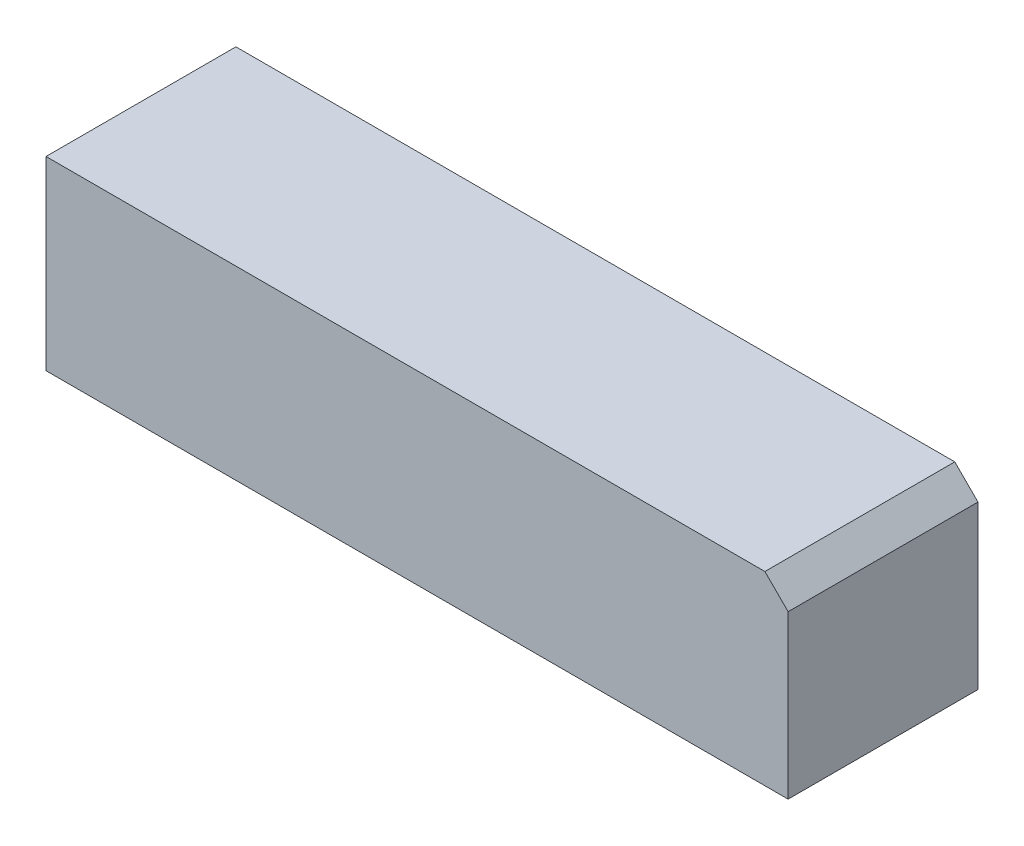
ISO-10303-21;
HEADER;
FILE_DESCRIPTION(('STEP AP214'),'2;1');
FILE_NAME('part.step','',(''),(''),'','','');
FILE_SCHEMA(('AUTOMOTIVE_DESIGN { 1 0 10303 214 1 1 1 1 }'));
ENDSEC;
DATA;
#1=APPLICATION_CONTEXT('core data for automotive mechanical design processes');
#2=APPLICATION_PROTOCOL_DEFINITION('international standard','automotive_design',2000,#1);
#3=PRODUCT_CONTEXT('',#1,'mechanical');
#4=PRODUCT('Part','Part','',(#3));
#5=PRODUCT_RELATED_PRODUCT_CATEGORY('part','',(#4));
#6=PRODUCT_DEFINITION_FORMATION('','',#4);
#7=PRODUCT_DEFINITION_CONTEXT('part definition',#1,'design');
#8=PRODUCT_DEFINITION('design','',#6,#7);
#9=PRODUCT_DEFINITION_SHAPE('','',#8);
#10=(LENGTH_UNIT() NAMED_UNIT(*) SI_UNIT(.MILLI.,.METRE.));
#11=(NAMED_UNIT(*) PLANE_ANGLE_UNIT() SI_UNIT($,.RADIAN.));
#12=(NAMED_UNIT(*) SI_UNIT($,.STERADIAN.) SOLID_ANGLE_UNIT());
#13=UNCERTAINTY_MEASURE_WITH_UNIT(LENGTH_MEASURE(1.E-05),#10,'distance_accuracy_value','');
#14=(GEOMETRIC_REPRESENTATION_CONTEXT(3) GLOBAL_UNCERTAINTY_ASSIGNED_CONTEXT((#13)) GLOBAL_UNIT_ASSIGNED_CONTEXT((#10,
#11,#12)) REPRESENTATION_CONTEXT('',''));
#15=CARTESIAN_POINT('',(0.,0.,0.));
#16=DIRECTION('',(0.,0.,1.));
#17=DIRECTION('',(1.,0.,0.));
#18=AXIS2_PLACEMENT_3D('',#15,#16,#17);
#19=CARTESIAN_POINT('',(4.76270828,1.270508,0.));
#20=DIRECTION('',(0.707106781186548,0.707106781186548,0.));
#21=DIRECTION('',(-0.707106781186548,0.707106781186548,0.));
#22=AXIS2_PLACEMENT_3D('',#19,#20,#21);
#23=PLANE('',#22);
#24=DIRECTION('',(0.,0.,-1.));
#25=VECTOR('',#24,1.);
#26=CARTESIAN_POINT('',(5.080508,0.95270828,0.));
#27=LINE('',#26,#25);
#28=CARTESIAN_POINT('',(5.080508,0.95270828,0.));
#29=VERTEX_POINT('',#28);
#30=CARTESIAN_POINT('',(5.080508,0.95270828,2.59999988));
#31=VERTEX_POINT('',#30);
#32=EDGE_CURVE('E78',#29,#31,#27,.F.);
#33=ORIENTED_EDGE('',*,*,#32,.F.);
#34=DIRECTION('',(-0.707106781186548,0.707106781186548,0.));
#35=VECTOR('',#34,1.);
#36=CARTESIAN_POINT('',(4.76270828,1.270508,0.));
#37=LINE('',#36,#35);
#38=CARTESIAN_POINT('',(4.76270828,1.270508,0.));
#39=VERTEX_POINT('',#38);
#40=EDGE_CURVE('E71',#29,#39,#37,.T.);
#41=ORIENTED_EDGE('',*,*,#40,.T.);
#42=DIRECTION('',(0.,0.,1.));
#43=VECTOR('',#42,1.);
#44=CARTESIAN_POINT('',(4.76270828,1.270508,0.));
#45=LINE('',#44,#43);
#46=CARTESIAN_POINT('',(4.76270828,1.270508,2.59999988));
#47=VERTEX_POINT('',#46);
#48=EDGE_CURVE('E74',#47,#39,#45,.F.);
#49=ORIENTED_EDGE('',*,*,#48,.F.);
#50=DIRECTION('',(-0.707106781186548,0.707106781186548,0.));
#51=VECTOR('',#50,1.);
#52=CARTESIAN_POINT('',(4.76270828,1.270508,2.59999988));
#53=LINE('',#52,#51);
#54=EDGE_CURVE('E60',#47,#31,#53,.F.);
#55=ORIENTED_EDGE('',*,*,#54,.T.);
#56=EDGE_LOOP('',(#33,#41,#49,#55));
#57=FACE_BOUND('',#56,.T.);
#58=ADVANCED_FACE('F17',(#57),#23,.T.);
#59=CARTESIAN_POINT('',(-5.08,1.270508,0.));
#60=DIRECTION('',(0.,1.,0.));
#61=DIRECTION('',(0.,0.,1.));
#62=AXIS2_PLACEMENT_3D('',#59,#60,#61);
#63=PLANE('',#62);
#64=ORIENTED_EDGE('',*,*,#48,.T.);
#65=DIRECTION('',(1.,0.,0.));
#66=VECTOR('',#65,1.);
#67=CARTESIAN_POINT('',(-5.08,1.270508,0.));
#68=LINE('',#67,#66);
#69=CARTESIAN_POINT('',(-5.080254,1.270254,0.));
#70=VERTEX_POINT('',#69);
#71=EDGE_CURVE('E120',#39,#70,#68,.F.);
#72=ORIENTED_EDGE('',*,*,#71,.T.);
#73=DIRECTION('',(0.,0.,-1.));
#74=VECTOR('',#73,1.);
#75=CARTESIAN_POINT('',(-5.080508,1.270508,0.));
#76=LINE('',#75,#74);
#77=CARTESIAN_POINT('',(-5.080254,1.270254,2.59999988));
#78=VERTEX_POINT('',#77);
#79=EDGE_CURVE('E81',#78,#70,#76,.T.);
#80=ORIENTED_EDGE('',*,*,#79,.F.);
#81=DIRECTION('',(1.,0.,0.));
#82=VECTOR('',#81,1.);
#83=CARTESIAN_POINT('',(-5.08,1.270508,2.59999988));
#84=LINE('',#83,#82);
#85=EDGE_CURVE('E66',#47,#78,#84,.F.);
#86=ORIENTED_EDGE('',*,*,#85,.F.);
#87=EDGE_LOOP('',(#64,#72,#80,#86));
#88=FACE_BOUND('',#87,.T.);
#89=ADVANCED_FACE('F80',(#88),#63,.T.);
#90=CARTESIAN_POINT('',(5.080508,0.95270828,0.));
#91=DIRECTION('',(1.,0.,0.));
#92=DIRECTION('',(0.,0.,-1.));
#93=AXIS2_PLACEMENT_3D('',#90,#91,#92);
#94=PLANE('',#93);
#95=DIRECTION('',(0.,0.,-1.));
#96=VECTOR('',#95,1.);
#97=CARTESIAN_POINT('',(5.080508,-1.270508,0.));
#98=LINE('',#97,#96);
#99=CARTESIAN_POINT('',(5.080508,-1.270508,0.));
#100=VERTEX_POINT('',#99);
#101=CARTESIAN_POINT('',(5.080508,-1.270508,2.59999988));
#102=VERTEX_POINT('',#101);
#103=EDGE_CURVE('E106',#100,#102,#98,.F.);
#104=ORIENTED_EDGE('',*,*,#103,.F.);
#105=DIRECTION('',(0.,1.,0.));
#106=VECTOR('',#105,1.);
#107=CARTESIAN_POINT('',(5.080508,1.270508,0.));
#108=LINE('',#107,#106);
#109=EDGE_CURVE('E117',#100,#29,#108,.T.);
#110=ORIENTED_EDGE('',*,*,#109,.T.);
#111=ORIENTED_EDGE('',*,*,#32,.T.);
#112=DIRECTION('',(0.,1.,0.));
#113=VECTOR('',#112,1.);
#114=CARTESIAN_POINT('',(5.080508,1.270508,2.59999988));
#115=LINE('',#114,#113);
#116=EDGE_CURVE('E70',#102,#31,#115,.T.);
#117=ORIENTED_EDGE('',*,*,#116,.F.);
#118=EDGE_LOOP('',(#104,#110,#111,#117));
#119=FACE_BOUND('',#118,.T.);
#120=ADVANCED_FACE('F134',(#119),#94,.T.);
#121=CARTESIAN_POINT('',(-5.08,1.270508,2.59999988));
#122=DIRECTION('',(0.,0.,1.));
#123=DIRECTION('',(1.,0.,0.));
#124=AXIS2_PLACEMENT_3D('',#121,#122,#123);
#125=PLANE('',#124);
#126=ORIENTED_EDGE('',*,*,#54,.F.);
#127=ORIENTED_EDGE('',*,*,#85,.T.);
#128=DIRECTION('',(0.,1.,0.));
#129=VECTOR('',#128,1.);
#130=CARTESIAN_POINT('',(-5.080508,-1.270508,2.59999988));
#131=LINE('',#130,#129);
#132=CARTESIAN_POINT('',(-5.080508,-1.270508,2.59999988));
#133=VERTEX_POINT('',#132);
#134=EDGE_CURVE('E83',#133,#78,#131,.T.);
#135=ORIENTED_EDGE('',*,*,#134,.F.);
#136=DIRECTION('',(1.,0.,0.));
#137=VECTOR('',#136,1.);
#138=CARTESIAN_POINT('',(5.080508,-1.270508,2.59999988));
#139=LINE('',#138,#137);
#140=EDGE_CURVE('E99',#102,#133,#139,.F.);
#141=ORIENTED_EDGE('',*,*,#140,.F.);
#142=ORIENTED_EDGE('',*,*,#116,.T.);
#143=EDGE_LOOP('',(#126,#127,#135,#141,#142));
#144=FACE_BOUND('',#143,.T.);
#145=ADVANCED_FACE('F64',(#144),#125,.T.);
#146=CARTESIAN_POINT('',(-5.080508,-1.270508,0.));
#147=DIRECTION('',(-1.,0.,0.));
#148=DIRECTION('',(0.,0.,1.));
#149=AXIS2_PLACEMENT_3D('',#146,#147,#148);
#150=PLANE('',#149);
#151=ORIENTED_EDGE('',*,*,#79,.T.);
#152=DIRECTION('',(0.,1.,0.));
#153=VECTOR('',#152,1.);
#154=CARTESIAN_POINT('',(-5.080508,1.270508,0.));
#155=LINE('',#154,#153);
#156=CARTESIAN_POINT('',(-5.080508,-1.270508,0.));
#157=VERTEX_POINT('',#156);
#158=EDGE_CURVE('E35',#70,#157,#155,.F.);
#159=ORIENTED_EDGE('',*,*,#158,.T.);
#160=DIRECTION('',(0.,0.,-1.));
#161=VECTOR('',#160,1.);
#162=CARTESIAN_POINT('',(-5.080508,-1.270508,0.));
#163=LINE('',#162,#161);
#164=EDGE_CURVE('E26',#133,#157,#163,.T.);
#165=ORIENTED_EDGE('',*,*,#164,.F.);
#166=ORIENTED_EDGE('',*,*,#134,.T.);
#167=EDGE_LOOP('',(#151,#159,#165,#166));
#168=FACE_BOUND('',#167,.T.);
#169=ADVANCED_FACE('F137',(#168),#150,.T.);
#170=CARTESIAN_POINT('',(-5.08,1.270508,0.));
#171=DIRECTION('',(0.,0.,1.));
#172=DIRECTION('',(1.,0.,0.));
#173=AXIS2_PLACEMENT_3D('',#170,#171,#172);
#174=PLANE('',#173);
#175=ORIENTED_EDGE('',*,*,#40,.F.);
#176=ORIENTED_EDGE('',*,*,#109,.F.);
#177=DIRECTION('',(1.,0.,0.));
#178=VECTOR('',#177,1.);
#179=CARTESIAN_POINT('',(5.080508,-1.270508,0.));
#180=LINE('',#179,#178);
#181=EDGE_CURVE('E11',#157,#100,#180,.T.);
#182=ORIENTED_EDGE('',*,*,#181,.F.);
#183=ORIENTED_EDGE('',*,*,#158,.F.);
#184=ORIENTED_EDGE('',*,*,#71,.F.);
#185=EDGE_LOOP('',(#175,#176,#182,#183,#184));
#186=FACE_BOUND('',#185,.T.);
#187=ADVANCED_FACE('F136',(#186),#174,.F.);
#188=CARTESIAN_POINT('',(5.080508,-1.270508,0.));
#189=DIRECTION('',(0.,-1.,0.));
#190=DIRECTION('',(0.,0.,-1.));
#191=AXIS2_PLACEMENT_3D('',#188,#189,#190);
#192=PLANE('',#191);
#193=ORIENTED_EDGE('',*,*,#164,.T.);
#194=ORIENTED_EDGE('',*,*,#181,.T.);
#195=ORIENTED_EDGE('',*,*,#103,.T.);
#196=ORIENTED_EDGE('',*,*,#140,.T.);
#197=EDGE_LOOP('',(#193,#194,#195,#196));
#198=FACE_BOUND('',#197,.T.);
#199=ADVANCED_FACE('F131',(#198),#192,.T.);
#200=CLOSED_SHELL('',(#58,#89,#120,#145,#169,#187,#199));
#201=MANIFOLD_SOLID_BREP('B1',#200);
#202=ADVANCED_BREP_SHAPE_REPRESENTATION('',(#18,#201),#14);
#203=SHAPE_DEFINITION_REPRESENTATION(#9,#202);
ENDSEC;
END-ISO-10303-21;
